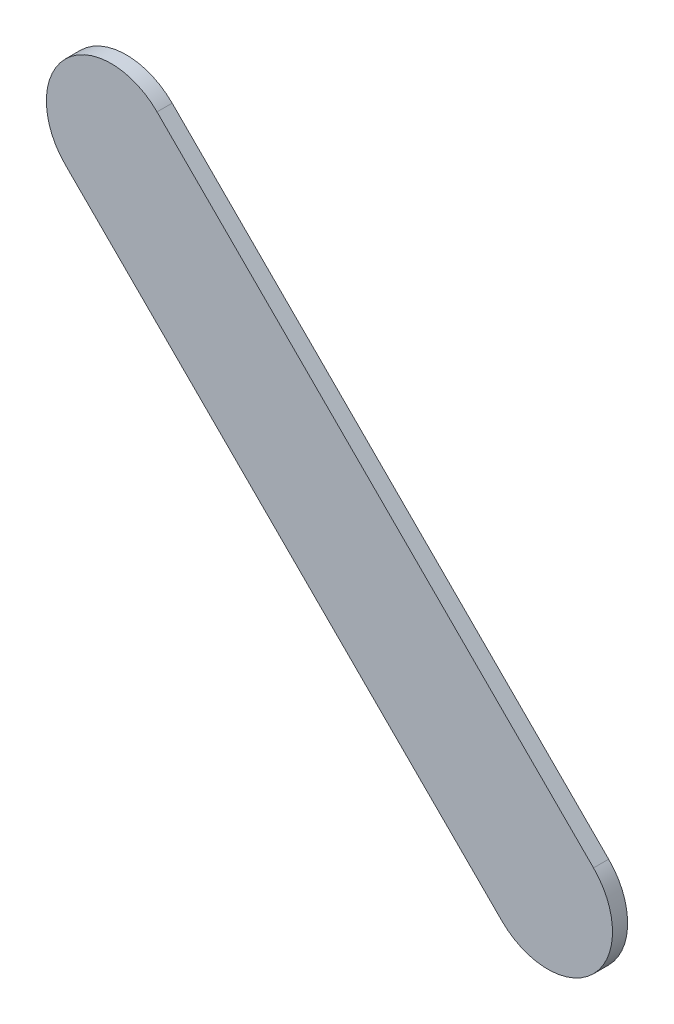
ISO-10303-21;
HEADER;
FILE_DESCRIPTION(('STEP AP214'),'2;1');
FILE_NAME('part.step','',(''),(''),'','','');
FILE_SCHEMA(('AUTOMOTIVE_DESIGN { 1 0 10303 214 1 1 1 1 }'));
ENDSEC;
DATA;
#1=APPLICATION_CONTEXT('core data for automotive mechanical design processes');
#2=APPLICATION_PROTOCOL_DEFINITION('international standard','automotive_design',2000,#1);
#3=PRODUCT_CONTEXT('',#1,'mechanical');
#4=PRODUCT('Part','Part','',(#3));
#5=PRODUCT_RELATED_PRODUCT_CATEGORY('part','',(#4));
#6=PRODUCT_DEFINITION_FORMATION('','',#4);
#7=PRODUCT_DEFINITION_CONTEXT('part definition',#1,'design');
#8=PRODUCT_DEFINITION('design','',#6,#7);
#9=PRODUCT_DEFINITION_SHAPE('','',#8);
#10=(LENGTH_UNIT() NAMED_UNIT(*) SI_UNIT(.MILLI.,.METRE.));
#11=(NAMED_UNIT(*) PLANE_ANGLE_UNIT() SI_UNIT($,.RADIAN.));
#12=(NAMED_UNIT(*) SI_UNIT($,.STERADIAN.) SOLID_ANGLE_UNIT());
#13=UNCERTAINTY_MEASURE_WITH_UNIT(LENGTH_MEASURE(1.E-05),#10,'distance_accuracy_value','');
#14=(GEOMETRIC_REPRESENTATION_CONTEXT(3) GLOBAL_UNCERTAINTY_ASSIGNED_CONTEXT((#13)) GLOBAL_UNIT_ASSIGNED_CONTEXT((#10,
#11,#12)) REPRESENTATION_CONTEXT('',''));
#15=CARTESIAN_POINT('',(0.,0.,0.));
#16=DIRECTION('',(0.,0.,1.));
#17=DIRECTION('',(1.,0.,0.));
#18=AXIS2_PLACEMENT_3D('',#15,#16,#17);
#19=CARTESIAN_POINT('',(132.733933,-46.276066,1.635));
#20=DIRECTION('',(0.,0.,1.));
#21=DIRECTION('',(1.,0.,0.));
#22=AXIS2_PLACEMENT_3D('',#19,#20,#21);
#23=PLANE('',#22);
#24=DIRECTION('',(0.707106781186548,-0.707106781186548,0.));
#25=VECTOR('',#24,1.);
#26=CARTESIAN_POINT('',(132.733933,-46.276066,1.635));
#27=LINE('',#26,#25);
#28=CARTESIAN_POINT('',(132.733933,-46.276066,1.635));
#29=VERTEX_POINT('',#28);
#30=CARTESIAN_POINT('',(133.743933,-47.286066,1.635));
#31=VERTEX_POINT('',#30);
#32=EDGE_CURVE('E96',#29,#31,#27,.T.);
#33=ORIENTED_EDGE('',*,*,#32,.T.);
#34=CARTESIAN_POINT('',(133.8499995,-47.1799995,1.635));
#35=DIRECTION('',(0.,0.,1.));
#36=DIRECTION('',(-0.707106781186548,-0.707106781186548,0.));
#37=AXIS2_PLACEMENT_3D('',#34,#35,#36);
#38=CIRCLE('',#37,0.150000682813);
#39=CARTESIAN_POINT('',(133.956066,-47.073933,1.635));
#40=VERTEX_POINT('',#39);
#41=EDGE_CURVE('E76',#31,#40,#38,.T.);
#42=ORIENTED_EDGE('',*,*,#41,.T.);
#43=DIRECTION('',(-0.707106781186548,0.707106781186548,0.));
#44=VECTOR('',#43,1.);
#45=CARTESIAN_POINT('',(133.956066,-47.073933,1.635));
#46=LINE('',#45,#44);
#47=CARTESIAN_POINT('',(132.946066,-46.063933,1.635));
#48=VERTEX_POINT('',#47);
#49=EDGE_CURVE('E80',#40,#48,#46,.T.);
#50=ORIENTED_EDGE('',*,*,#49,.T.);
#51=CARTESIAN_POINT('',(132.8399995,-46.1699995,1.635));
#52=DIRECTION('',(0.,0.,1.));
#53=DIRECTION('',(0.707106781186548,0.707106781186548,0.));
#54=AXIS2_PLACEMENT_3D('',#51,#52,#53);
#55=CIRCLE('',#54,0.150000682813);
#56=EDGE_CURVE('E11',#48,#29,#55,.T.);
#57=ORIENTED_EDGE('',*,*,#56,.T.);
#58=EDGE_LOOP('',(#33,#42,#50,#57));
#59=FACE_BOUND('',#58,.T.);
#60=ADVANCED_FACE('F17',(#59),#23,.T.);
#61=CARTESIAN_POINT('',(132.733933,-46.276066,1.6));
#62=DIRECTION('',(0.,0.,1.));
#63=DIRECTION('',(1.,0.,0.));
#64=AXIS2_PLACEMENT_3D('',#61,#62,#63);
#65=PLANE('',#64);
#66=CARTESIAN_POINT('',(132.8399995,-46.1699995,1.6));
#67=DIRECTION('',(0.,0.,1.));
#68=DIRECTION('',(0.707106781186548,0.707106781186548,0.));
#69=AXIS2_PLACEMENT_3D('',#66,#67,#68);
#70=CIRCLE('',#69,0.150000682813);
#71=CARTESIAN_POINT('',(132.946066,-46.063933,1.6));
#72=VERTEX_POINT('',#71);
#73=CARTESIAN_POINT('',(132.733933,-46.276066,1.6));
#74=VERTEX_POINT('',#73);
#75=EDGE_CURVE('E26',#72,#74,#70,.T.);
#76=ORIENTED_EDGE('',*,*,#75,.F.);
#77=DIRECTION('',(-0.707106781186548,0.707106781186548,0.));
#78=VECTOR('',#77,1.);
#79=CARTESIAN_POINT('',(133.956066,-47.073933,1.6));
#80=LINE('',#79,#78);
#81=CARTESIAN_POINT('',(133.956066,-47.073933,1.6));
#82=VERTEX_POINT('',#81);
#83=EDGE_CURVE('E67',#82,#72,#80,.T.);
#84=ORIENTED_EDGE('',*,*,#83,.F.);
#85=CARTESIAN_POINT('',(133.8499995,-47.1799995,1.6));
#86=DIRECTION('',(0.,0.,1.));
#87=DIRECTION('',(-0.707106781186548,-0.707106781186548,0.));
#88=AXIS2_PLACEMENT_3D('',#85,#86,#87);
#89=CIRCLE('',#88,0.150000682813);
#90=CARTESIAN_POINT('',(133.743933,-47.286066,1.6));
#91=VERTEX_POINT('',#90);
#92=EDGE_CURVE('E70',#91,#82,#89,.T.);
#93=ORIENTED_EDGE('',*,*,#92,.F.);
#94=DIRECTION('',(0.707106781186548,-0.707106781186548,0.));
#95=VECTOR('',#94,1.);
#96=CARTESIAN_POINT('',(132.733933,-46.276066,1.6));
#97=LINE('',#96,#95);
#98=EDGE_CURVE('E113',#74,#91,#97,.T.);
#99=ORIENTED_EDGE('',*,*,#98,.F.);
#100=EDGE_LOOP('',(#76,#84,#93,#99));
#101=FACE_BOUND('',#100,.T.);
#102=ADVANCED_FACE('F19',(#101),#65,.F.);
#103=CARTESIAN_POINT('',(132.8399995,-46.1699995,1.6));
#104=DIRECTION('',(0.,0.,-1.));
#105=DIRECTION('',(0.707106781186548,0.707106781186548,0.));
#106=AXIS2_PLACEMENT_3D('',#103,#104,#105);
#107=CYLINDRICAL_SURFACE('',#106,0.150000682813);
#108=ORIENTED_EDGE('',*,*,#75,.T.);
#109=DIRECTION('',(0.,0.,1.));
#110=VECTOR('',#109,1.);
#111=CARTESIAN_POINT('',(132.733933,-46.276066,1.6));
#112=LINE('',#111,#110);
#113=EDGE_CURVE('E90',#74,#29,#112,.T.);
#114=ORIENTED_EDGE('',*,*,#113,.T.);
#115=ORIENTED_EDGE('',*,*,#56,.F.);
#116=DIRECTION('',(0.,0.,1.));
#117=VECTOR('',#116,1.);
#118=CARTESIAN_POINT('',(132.946066,-46.063933,1.6));
#119=LINE('',#118,#117);
#120=EDGE_CURVE('E75',#72,#48,#119,.T.);
#121=ORIENTED_EDGE('',*,*,#120,.F.);
#122=EDGE_LOOP('',(#108,#114,#115,#121));
#123=FACE_BOUND('',#122,.T.);
#124=ADVANCED_FACE('F129',(#123),#107,.T.);
#125=CARTESIAN_POINT('',(133.956066,-47.073933,1.6));
#126=DIRECTION('',(-0.707106781186548,-0.707106781186548,0.));
#127=DIRECTION('',(-0.707106781186548,0.707106781186548,0.));
#128=AXIS2_PLACEMENT_3D('',#125,#126,#127);
#129=PLANE('',#128);
#130=ORIENTED_EDGE('',*,*,#83,.T.);
#131=ORIENTED_EDGE('',*,*,#120,.T.);
#132=ORIENTED_EDGE('',*,*,#49,.F.);
#133=DIRECTION('',(0.,0.,1.));
#134=VECTOR('',#133,1.);
#135=CARTESIAN_POINT('',(133.956066,-47.073933,1.6));
#136=LINE('',#135,#134);
#137=EDGE_CURVE('E78',#82,#40,#136,.T.);
#138=ORIENTED_EDGE('',*,*,#137,.F.);
#139=EDGE_LOOP('',(#130,#131,#132,#138));
#140=FACE_BOUND('',#139,.T.);
#141=ADVANCED_FACE('F79',(#140),#129,.F.);
#142=CARTESIAN_POINT('',(133.8499995,-47.1799995,1.6));
#143=DIRECTION('',(0.,0.,-1.));
#144=DIRECTION('',(-0.707106781186548,-0.707106781186548,0.));
#145=AXIS2_PLACEMENT_3D('',#142,#143,#144);
#146=CYLINDRICAL_SURFACE('',#145,0.150000682813);
#147=ORIENTED_EDGE('',*,*,#92,.T.);
#148=ORIENTED_EDGE('',*,*,#137,.T.);
#149=ORIENTED_EDGE('',*,*,#41,.F.);
#150=DIRECTION('',(0.,0.,1.));
#151=VECTOR('',#150,1.);
#152=CARTESIAN_POINT('',(133.743933,-47.286066,1.6));
#153=LINE('',#152,#151);
#154=EDGE_CURVE('E87',#91,#31,#153,.T.);
#155=ORIENTED_EDGE('',*,*,#154,.F.);
#156=EDGE_LOOP('',(#147,#148,#149,#155));
#157=FACE_BOUND('',#156,.T.);
#158=ADVANCED_FACE('F85',(#157),#146,.T.);
#159=CARTESIAN_POINT('',(132.733933,-46.276066,1.6));
#160=DIRECTION('',(0.707106781186548,0.707106781186548,0.));
#161=DIRECTION('',(0.,0.,-1.));
#162=AXIS2_PLACEMENT_3D('',#159,#160,#161);
#163=PLANE('',#162);
#164=ORIENTED_EDGE('',*,*,#98,.T.);
#165=ORIENTED_EDGE('',*,*,#154,.T.);
#166=ORIENTED_EDGE('',*,*,#32,.F.);
#167=ORIENTED_EDGE('',*,*,#113,.F.);
#168=EDGE_LOOP('',(#164,#165,#166,#167));
#169=FACE_BOUND('',#168,.T.);
#170=ADVANCED_FACE('F126',(#169),#163,.F.);
#171=CLOSED_SHELL('',(#60,#102,#124,#141,#158,#170));
#172=MANIFOLD_SOLID_BREP('B1',#171);
#173=ADVANCED_BREP_SHAPE_REPRESENTATION('',(#18,#172),#14);
#174=SHAPE_DEFINITION_REPRESENTATION(#9,#173);
ENDSEC;
END-ISO-10303-21;
